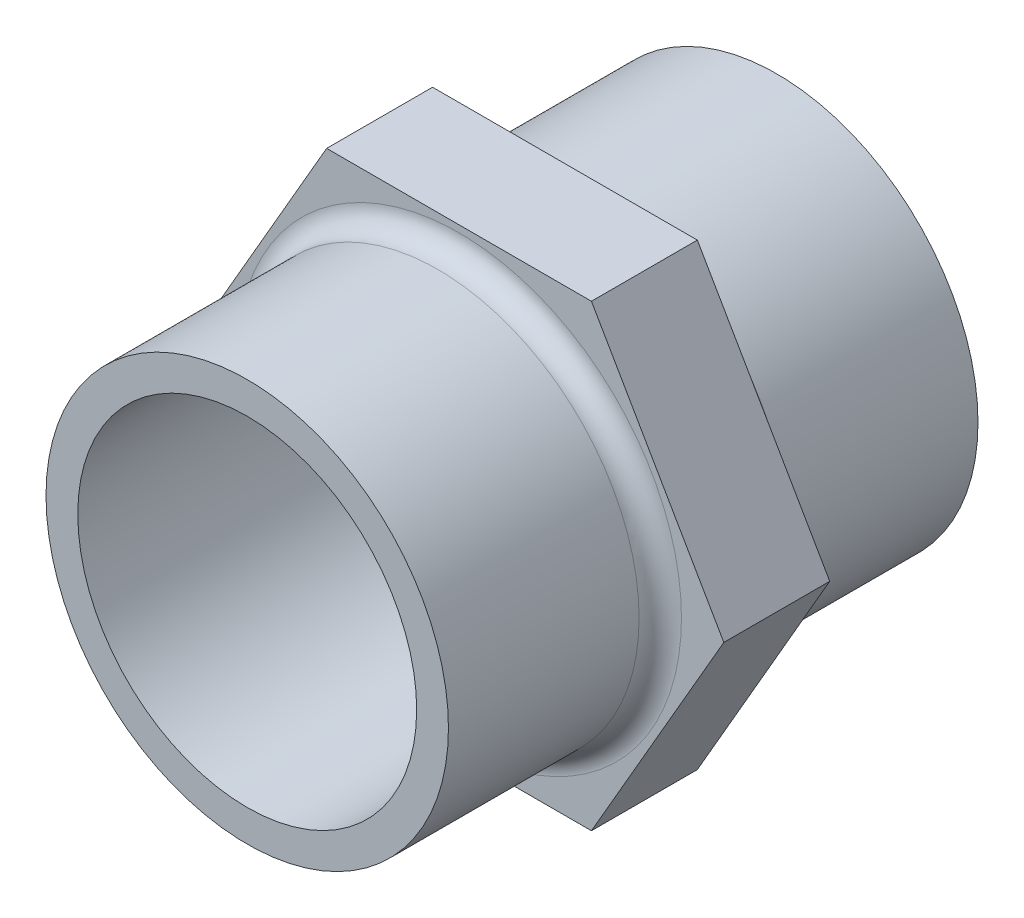
ISO-10303-21;
HEADER;
FILE_DESCRIPTION(('STEP AP214'),'2;1');
FILE_NAME('part.step','',(''),(''),'','','');
FILE_SCHEMA(('AUTOMOTIVE_DESIGN { 1 0 10303 214 1 1 1 1 }'));
ENDSEC;
DATA;
#1=APPLICATION_CONTEXT('core data for automotive mechanical design processes');
#2=APPLICATION_PROTOCOL_DEFINITION('international standard','automotive_design',2000,#1);
#3=PRODUCT_CONTEXT('',#1,'mechanical');
#4=PRODUCT('Part','Part','',(#3));
#5=PRODUCT_RELATED_PRODUCT_CATEGORY('part','',(#4));
#6=PRODUCT_DEFINITION_FORMATION('','',#4);
#7=PRODUCT_DEFINITION_CONTEXT('part definition',#1,'design');
#8=PRODUCT_DEFINITION('design','',#6,#7);
#9=PRODUCT_DEFINITION_SHAPE('','',#8);
#10=(LENGTH_UNIT() NAMED_UNIT(*) SI_UNIT(.MILLI.,.METRE.));
#11=(NAMED_UNIT(*) PLANE_ANGLE_UNIT() SI_UNIT($,.RADIAN.));
#12=(NAMED_UNIT(*) SI_UNIT($,.STERADIAN.) SOLID_ANGLE_UNIT());
#13=UNCERTAINTY_MEASURE_WITH_UNIT(LENGTH_MEASURE(1.E-05),#10,'distance_accuracy_value','');
#14=(GEOMETRIC_REPRESENTATION_CONTEXT(3) GLOBAL_UNCERTAINTY_ASSIGNED_CONTEXT((#13)) GLOBAL_UNIT_ASSIGNED_CONTEXT((#10,
#11,#12)) REPRESENTATION_CONTEXT('',''));
#15=CARTESIAN_POINT('',(0.,0.,0.));
#16=DIRECTION('',(0.,0.,1.));
#17=DIRECTION('',(1.,0.,0.));
#18=AXIS2_PLACEMENT_3D('',#15,#16,#17);
#19=CARTESIAN_POINT('',(-12.5,0.,2.5));
#20=DIRECTION('',(0.866025403784439,0.5,0.));
#21=DIRECTION('',(-0.5,0.866025403784439,0.));
#22=AXIS2_PLACEMENT_3D('',#19,#20,#21);
#23=PLANE('',#22);
#24=DIRECTION('',(0.5,-0.866025403784439,0.));
#25=VECTOR('',#24,1.);
#26=CARTESIAN_POINT('',(-12.5,0.,-2.5));
#27=LINE('',#26,#25);
#28=CARTESIAN_POINT('',(-12.5,0.,-2.5));
#29=VERTEX_POINT('',#28);
#30=CARTESIAN_POINT('',(-6.25,-10.8253175473055,-2.5));
#31=VERTEX_POINT('',#30);
#32=EDGE_CURVE('E125',#29,#31,#27,.T.);
#33=ORIENTED_EDGE('',*,*,#32,.T.);
#34=DIRECTION('',(0.,0.,-1.));
#35=VECTOR('',#34,1.);
#36=CARTESIAN_POINT('',(-6.25,-10.8253175473055,2.5));
#37=LINE('',#36,#35);
#38=CARTESIAN_POINT('',(-6.25,-10.8253175473055,2.5));
#39=VERTEX_POINT('',#38);
#40=EDGE_CURVE('E143',#39,#31,#37,.T.);
#41=ORIENTED_EDGE('',*,*,#40,.F.);
#42=DIRECTION('',(0.5,-0.866025403784439,0.));
#43=VECTOR('',#42,1.);
#44=CARTESIAN_POINT('',(-12.5,0.,2.5));
#45=LINE('',#44,#43);
#46=CARTESIAN_POINT('',(-12.5,0.,2.5));
#47=VERTEX_POINT('',#46);
#48=EDGE_CURVE('E136',#47,#39,#45,.T.);
#49=ORIENTED_EDGE('',*,*,#48,.F.);
#50=DIRECTION('',(0.,0.,-1.));
#51=VECTOR('',#50,1.);
#52=CARTESIAN_POINT('',(-12.5,0.,2.5));
#53=LINE('',#52,#51);
#54=EDGE_CURVE('E121',#47,#29,#53,.T.);
#55=ORIENTED_EDGE('',*,*,#54,.T.);
#56=EDGE_LOOP('',(#33,#41,#49,#55));
#57=FACE_BOUND('',#56,.T.);
#58=ADVANCED_FACE('F39',(#57),#23,.F.);
#59=CARTESIAN_POINT('',(-6.25,-10.8253175473055,2.5));
#60=DIRECTION('',(0.,1.,0.));
#61=DIRECTION('',(0.,0.,1.));
#62=AXIS2_PLACEMENT_3D('',#59,#60,#61);
#63=PLANE('',#62);
#64=DIRECTION('',(1.,0.,0.));
#65=VECTOR('',#64,1.);
#66=CARTESIAN_POINT('',(-6.25,-10.8253175473055,-2.5));
#67=LINE('',#66,#65);
#68=CARTESIAN_POINT('',(6.25,-10.8253175473055,-2.5));
#69=VERTEX_POINT('',#68);
#70=EDGE_CURVE('E128',#31,#69,#67,.T.);
#71=ORIENTED_EDGE('',*,*,#70,.T.);
#72=DIRECTION('',(0.,0.,-1.));
#73=VECTOR('',#72,1.);
#74=CARTESIAN_POINT('',(6.25,-10.8253175473055,2.5));
#75=LINE('',#74,#73);
#76=CARTESIAN_POINT('',(6.25,-10.8253175473055,2.5));
#77=VERTEX_POINT('',#76);
#78=EDGE_CURVE('E140',#77,#69,#75,.T.);
#79=ORIENTED_EDGE('',*,*,#78,.F.);
#80=DIRECTION('',(1.,0.,0.));
#81=VECTOR('',#80,1.);
#82=CARTESIAN_POINT('',(-6.25,-10.8253175473055,2.5));
#83=LINE('',#82,#81);
#84=EDGE_CURVE('E94',#39,#77,#83,.T.);
#85=ORIENTED_EDGE('',*,*,#84,.F.);
#86=ORIENTED_EDGE('',*,*,#40,.T.);
#87=EDGE_LOOP('',(#71,#79,#85,#86));
#88=FACE_BOUND('',#87,.T.);
#89=ADVANCED_FACE('F164',(#88),#63,.F.);
#90=CARTESIAN_POINT('',(6.25,-10.8253175473055,2.5));
#91=DIRECTION('',(-0.866025403784439,0.5,0.));
#92=DIRECTION('',(-0.5,-0.866025403784439,0.));
#93=AXIS2_PLACEMENT_3D('',#90,#91,#92);
#94=PLANE('',#93);
#95=DIRECTION('',(0.5,0.866025403784439,0.));
#96=VECTOR('',#95,1.);
#97=CARTESIAN_POINT('',(6.25,-10.8253175473055,-2.5));
#98=LINE('',#97,#96);
#99=CARTESIAN_POINT('',(12.5,0.,-2.5));
#100=VERTEX_POINT('',#99);
#101=EDGE_CURVE('E131',#69,#100,#98,.T.);
#102=ORIENTED_EDGE('',*,*,#101,.T.);
#103=DIRECTION('',(0.,0.,-1.));
#104=VECTOR('',#103,1.);
#105=CARTESIAN_POINT('',(12.5,0.,2.5));
#106=LINE('',#105,#104);
#107=CARTESIAN_POINT('',(12.5,0.,2.5));
#108=VERTEX_POINT('',#107);
#109=EDGE_CURVE('E116',#108,#100,#106,.T.);
#110=ORIENTED_EDGE('',*,*,#109,.F.);
#111=DIRECTION('',(0.5,0.866025403784439,0.));
#112=VECTOR('',#111,1.);
#113=CARTESIAN_POINT('',(6.25,-10.8253175473055,2.5));
#114=LINE('',#113,#112);
#115=EDGE_CURVE('E107',#77,#108,#114,.T.);
#116=ORIENTED_EDGE('',*,*,#115,.F.);
#117=ORIENTED_EDGE('',*,*,#78,.T.);
#118=EDGE_LOOP('',(#102,#110,#116,#117));
#119=FACE_BOUND('',#118,.T.);
#120=ADVANCED_FACE('F170',(#119),#94,.F.);
#121=CARTESIAN_POINT('',(6.25,10.8253175473055,2.5));
#122=DIRECTION('',(-0.866025403784439,-0.5,0.));
#123=DIRECTION('',(0.5,-0.866025403784439,0.));
#124=AXIS2_PLACEMENT_3D('',#121,#122,#123);
#125=PLANE('',#124);
#126=DIRECTION('',(-0.5,0.866025403784439,0.));
#127=VECTOR('',#126,1.);
#128=CARTESIAN_POINT('',(6.25,10.8253175473055,-2.5));
#129=LINE('',#128,#127);
#130=CARTESIAN_POINT('',(6.25,10.8253175473055,-2.5));
#131=VERTEX_POINT('',#130);
#132=EDGE_CURVE('E115',#100,#131,#129,.T.);
#133=ORIENTED_EDGE('',*,*,#132,.T.);
#134=DIRECTION('',(0.,0.,-1.));
#135=VECTOR('',#134,1.);
#136=CARTESIAN_POINT('',(6.25,10.8253175473055,2.5));
#137=LINE('',#136,#135);
#138=CARTESIAN_POINT('',(6.25,10.8253175473055,2.5));
#139=VERTEX_POINT('',#138);
#140=EDGE_CURVE('E112',#139,#131,#137,.T.);
#141=ORIENTED_EDGE('',*,*,#140,.F.);
#142=DIRECTION('',(-0.5,0.866025403784439,0.));
#143=VECTOR('',#142,1.);
#144=CARTESIAN_POINT('',(6.25,10.8253175473055,2.5));
#145=LINE('',#144,#143);
#146=EDGE_CURVE('E101',#108,#139,#145,.T.);
#147=ORIENTED_EDGE('',*,*,#146,.F.);
#148=ORIENTED_EDGE('',*,*,#109,.T.);
#149=EDGE_LOOP('',(#133,#141,#147,#148));
#150=FACE_BOUND('',#149,.T.);
#151=ADVANCED_FACE('F113',(#150),#125,.F.);
#152=CARTESIAN_POINT('',(-6.25,10.8253175473055,2.5));
#153=DIRECTION('',(0.,-1.,0.));
#154=DIRECTION('',(0.,0.,-1.));
#155=AXIS2_PLACEMENT_3D('',#152,#153,#154);
#156=PLANE('',#155);
#157=DIRECTION('',(-1.,0.,0.));
#158=VECTOR('',#157,1.);
#159=CARTESIAN_POINT('',(-6.25,10.8253175473055,-2.5));
#160=LINE('',#159,#158);
#161=CARTESIAN_POINT('',(-6.25,10.8253175473055,-2.5));
#162=VERTEX_POINT('',#161);
#163=EDGE_CURVE('E79',#131,#162,#160,.T.);
#164=ORIENTED_EDGE('',*,*,#163,.T.);
#165=DIRECTION('',(0.,0.,-1.));
#166=VECTOR('',#165,1.);
#167=CARTESIAN_POINT('',(-6.25,10.8253175473055,2.5));
#168=LINE('',#167,#166);
#169=CARTESIAN_POINT('',(-6.25,10.8253175473055,2.5));
#170=VERTEX_POINT('',#169);
#171=EDGE_CURVE('E117',#170,#162,#168,.T.);
#172=ORIENTED_EDGE('',*,*,#171,.F.);
#173=DIRECTION('',(-1.,0.,0.));
#174=VECTOR('',#173,1.);
#175=CARTESIAN_POINT('',(-6.25,10.8253175473055,2.5));
#176=LINE('',#175,#174);
#177=EDGE_CURVE('E105',#139,#170,#176,.T.);
#178=ORIENTED_EDGE('',*,*,#177,.F.);
#179=ORIENTED_EDGE('',*,*,#140,.T.);
#180=EDGE_LOOP('',(#164,#172,#178,#179));
#181=FACE_BOUND('',#180,.T.);
#182=ADVANCED_FACE('F119',(#181),#156,.F.);
#183=CARTESIAN_POINT('',(-12.5,0.,2.5));
#184=DIRECTION('',(0.866025403784439,-0.5,0.));
#185=DIRECTION('',(0.5,0.866025403784439,0.));
#186=AXIS2_PLACEMENT_3D('',#183,#184,#185);
#187=PLANE('',#186);
#188=DIRECTION('',(-0.5,-0.866025403784439,0.));
#189=VECTOR('',#188,1.);
#190=CARTESIAN_POINT('',(-12.5,0.,-2.5));
#191=LINE('',#190,#189);
#192=EDGE_CURVE('E85',#162,#29,#191,.T.);
#193=ORIENTED_EDGE('',*,*,#192,.T.);
#194=ORIENTED_EDGE('',*,*,#54,.F.);
#195=DIRECTION('',(-0.5,-0.866025403784439,0.));
#196=VECTOR('',#195,1.);
#197=CARTESIAN_POINT('',(-12.5,0.,2.5));
#198=LINE('',#197,#196);
#199=EDGE_CURVE('E56',#170,#47,#198,.T.);
#200=ORIENTED_EDGE('',*,*,#199,.F.);
#201=ORIENTED_EDGE('',*,*,#171,.T.);
#202=EDGE_LOOP('',(#193,#194,#200,#201));
#203=FACE_BOUND('',#202,.T.);
#204=ADVANCED_FACE('F180',(#203),#187,.F.);
#205=CARTESIAN_POINT('',(0.,0.,2.5));
#206=DIRECTION('',(0.,0.,1.));
#207=DIRECTION('',(1.,0.,0.));
#208=AXIS2_PLACEMENT_3D('',#205,#206,#207);
#209=PLANE('',#208);
#210=CARTESIAN_POINT('',(0.,0.,2.5));
#211=DIRECTION('',(0.,0.,1.));
#212=DIRECTION('',(1.,0.,0.));
#213=AXIS2_PLACEMENT_3D('',#210,#211,#212);
#214=CIRCLE('',#213,10.5);
#215=CARTESIAN_POINT('',(10.5,0.,2.5));
#216=VERTEX_POINT('',#215);
#217=EDGE_CURVE('E48',#216,#216,#214,.F.);
#218=ORIENTED_EDGE('',*,*,#217,.T.);
#219=EDGE_LOOP('',(#218));
#220=FACE_BOUND('',#219,.T.);
#221=ORIENTED_EDGE('',*,*,#48,.T.);
#222=ORIENTED_EDGE('',*,*,#84,.T.);
#223=ORIENTED_EDGE('',*,*,#115,.T.);
#224=ORIENTED_EDGE('',*,*,#146,.T.);
#225=ORIENTED_EDGE('',*,*,#177,.T.);
#226=ORIENTED_EDGE('',*,*,#199,.T.);
#227=EDGE_LOOP('',(#221,#222,#223,#224,#225,#226));
#228=FACE_BOUND('',#227,.T.);
#229=ADVANCED_FACE('F103',(#220,#228),#209,.T.);
#230=CARTESIAN_POINT('',(0.,0.,-2.5));
#231=DIRECTION('',(0.,0.,1.));
#232=DIRECTION('',(1.,0.,0.));
#233=AXIS2_PLACEMENT_3D('',#230,#231,#232);
#234=PLANE('',#233);
#235=CARTESIAN_POINT('',(0.,0.,-2.5));
#236=DIRECTION('',(0.,0.,1.));
#237=DIRECTION('',(1.,0.,0.));
#238=AXIS2_PLACEMENT_3D('',#235,#236,#237);
#239=CIRCLE('',#238,10.5);
#240=CARTESIAN_POINT('',(10.5,0.,-2.5));
#241=VERTEX_POINT('',#240);
#242=EDGE_CURVE('E148',#241,#241,#239,.T.);
#243=ORIENTED_EDGE('',*,*,#242,.T.);
#244=EDGE_LOOP('',(#243));
#245=FACE_BOUND('',#244,.T.);
#246=ORIENTED_EDGE('',*,*,#32,.F.);
#247=ORIENTED_EDGE('',*,*,#192,.F.);
#248=ORIENTED_EDGE('',*,*,#163,.F.);
#249=ORIENTED_EDGE('',*,*,#132,.F.);
#250=ORIENTED_EDGE('',*,*,#101,.F.);
#251=ORIENTED_EDGE('',*,*,#70,.F.);
#252=EDGE_LOOP('',(#246,#247,#248,#249,#250,#251));
#253=FACE_BOUND('',#252,.T.);
#254=ADVANCED_FACE('F183',(#245,#253),#234,.F.);
#255=CARTESIAN_POINT('',(0.,0.,-12.5));
#256=DIRECTION('',(0.,0.,1.));
#257=DIRECTION('',(1.,0.,0.));
#258=AXIS2_PLACEMENT_3D('',#255,#256,#257);
#259=PLANE('',#258);
#260=CARTESIAN_POINT('',(0.,0.,-12.5));
#261=DIRECTION('',(0.,0.,1.));
#262=DIRECTION('',(1.,0.,0.));
#263=AXIS2_PLACEMENT_3D('',#260,#261,#262);
#264=CIRCLE('',#263,8.);
#265=CARTESIAN_POINT('',(8.,0.,-12.5));
#266=VERTEX_POINT('',#265);
#267=EDGE_CURVE('E209',#266,#266,#264,.T.);
#268=ORIENTED_EDGE('',*,*,#267,.T.);
#269=EDGE_LOOP('',(#268));
#270=FACE_BOUND('',#269,.T.);
#271=CARTESIAN_POINT('',(0.,0.,-12.5));
#272=DIRECTION('',(0.,0.,1.));
#273=DIRECTION('',(1.,0.,0.));
#274=AXIS2_PLACEMENT_3D('',#271,#272,#273);
#275=CIRCLE('',#274,9.5);
#276=CARTESIAN_POINT('',(9.5,0.,-12.5));
#277=VERTEX_POINT('',#276);
#278=EDGE_CURVE('E214',#277,#277,#275,.T.);
#279=ORIENTED_EDGE('',*,*,#278,.F.);
#280=EDGE_LOOP('',(#279));
#281=FACE_BOUND('',#280,.T.);
#282=ADVANCED_FACE('F186',(#270,#281),#259,.F.);
#283=CARTESIAN_POINT('',(0.,0.,12.5));
#284=DIRECTION('',(0.,0.,-1.));
#285=DIRECTION('',(-1.,0.,0.));
#286=AXIS2_PLACEMENT_3D('',#283,#284,#285);
#287=CYLINDRICAL_SURFACE('',#286,9.5);
#288=CARTESIAN_POINT('',(0.,0.,-3.5));
#289=DIRECTION('',(0.,0.,1.));
#290=DIRECTION('',(1.,0.,0.));
#291=AXIS2_PLACEMENT_3D('',#288,#289,#290);
#292=CIRCLE('',#291,9.5);
#293=CARTESIAN_POINT('',(9.5,0.,-3.5));
#294=VERTEX_POINT('',#293);
#295=EDGE_CURVE('E145',#294,#294,#292,.F.);
#296=ORIENTED_EDGE('',*,*,#295,.T.);
#297=EDGE_LOOP('',(#296));
#298=FACE_BOUND('',#297,.T.);
#299=ORIENTED_EDGE('',*,*,#278,.T.);
#300=EDGE_LOOP('',(#299));
#301=FACE_BOUND('',#300,.T.);
#302=ADVANCED_FACE('F194',(#298,#301),#287,.T.);
#303=CARTESIAN_POINT('',(0.,0.,3.5));
#304=DIRECTION('',(0.,0.,1.));
#305=DIRECTION('',(1.,0.,0.));
#306=AXIS2_PLACEMENT_3D('',#303,#304,#305);
#307=CIRCLE('',#306,9.5);
#308=CARTESIAN_POINT('',(9.5,0.,3.5));
#309=VERTEX_POINT('',#308);
#310=EDGE_CURVE('E11',#309,#309,#307,.T.);
#311=ORIENTED_EDGE('',*,*,#310,.T.);
#312=EDGE_LOOP('',(#311));
#313=FACE_BOUND('',#312,.T.);
#314=CARTESIAN_POINT('',(0.,0.,12.5));
#315=DIRECTION('',(0.,0.,1.));
#316=DIRECTION('',(1.,0.,0.));
#317=AXIS2_PLACEMENT_3D('',#314,#315,#316);
#318=CIRCLE('',#317,9.5);
#319=CARTESIAN_POINT('',(9.5,0.,12.5));
#320=VERTEX_POINT('',#319);
#321=EDGE_CURVE('E129',#320,#320,#318,.T.);
#322=ORIENTED_EDGE('',*,*,#321,.F.);
#323=EDGE_LOOP('',(#322));
#324=FACE_BOUND('',#323,.T.);
#325=ADVANCED_FACE('F190',(#313,#324),#287,.T.);
#326=CARTESIAN_POINT('',(0.,0.,12.5));
#327=DIRECTION('',(0.,0.,1.));
#328=DIRECTION('',(1.,0.,0.));
#329=AXIS2_PLACEMENT_3D('',#326,#327,#328);
#330=PLANE('',#329);
#331=CARTESIAN_POINT('',(0.,0.,12.5));
#332=DIRECTION('',(0.,0.,1.));
#333=DIRECTION('',(1.,0.,0.));
#334=AXIS2_PLACEMENT_3D('',#331,#332,#333);
#335=CIRCLE('',#334,8.);
#336=CARTESIAN_POINT('',(8.,0.,12.5));
#337=VERTEX_POINT('',#336);
#338=EDGE_CURVE('E212',#337,#337,#335,.T.);
#339=ORIENTED_EDGE('',*,*,#338,.F.);
#340=EDGE_LOOP('',(#339));
#341=FACE_BOUND('',#340,.T.);
#342=ORIENTED_EDGE('',*,*,#321,.T.);
#343=EDGE_LOOP('',(#342));
#344=FACE_BOUND('',#343,.T.);
#345=ADVANCED_FACE('F193',(#341,#344),#330,.T.);
#346=CARTESIAN_POINT('',(0.,0.,-12.5));
#347=DIRECTION('',(0.,0.,1.));
#348=DIRECTION('',(1.,0.,0.));
#349=AXIS2_PLACEMENT_3D('',#346,#347,#348);
#350=CYLINDRICAL_SURFACE('',#349,8.);
#351=ORIENTED_EDGE('',*,*,#267,.F.);
#352=EDGE_LOOP('',(#351));
#353=FACE_BOUND('',#352,.T.);
#354=ORIENTED_EDGE('',*,*,#338,.T.);
#355=EDGE_LOOP('',(#354));
#356=FACE_BOUND('',#355,.T.);
#357=ADVANCED_FACE('F160',(#353,#356),#350,.F.);
#358=CARTESIAN_POINT('',(0.,0.,-3.5));
#359=DIRECTION('',(0.,0.,1.));
#360=DIRECTION('',(1.,0.,0.));
#361=AXIS2_PLACEMENT_3D('',#358,#359,#360);
#362=TOROIDAL_SURFACE('',#361,10.5,1.);
#363=ORIENTED_EDGE('',*,*,#242,.F.);
#364=EDGE_LOOP('',(#363));
#365=FACE_BOUND('',#364,.T.);
#366=ORIENTED_EDGE('',*,*,#295,.F.);
#367=EDGE_LOOP('',(#366));
#368=FACE_BOUND('',#367,.T.);
#369=ADVANCED_FACE('F155',(#365,#368),#362,.F.);
#370=CARTESIAN_POINT('',(0.,0.,3.5));
#371=DIRECTION('',(0.,0.,1.));
#372=DIRECTION('',(1.,0.,0.));
#373=AXIS2_PLACEMENT_3D('',#370,#371,#372);
#374=TOROIDAL_SURFACE('',#373,10.5,1.);
#375=ORIENTED_EDGE('',*,*,#310,.F.);
#376=EDGE_LOOP('',(#375));
#377=FACE_BOUND('',#376,.T.);
#378=ORIENTED_EDGE('',*,*,#217,.F.);
#379=EDGE_LOOP('',(#378));
#380=FACE_BOUND('',#379,.T.);
#381=ADVANCED_FACE('F41',(#377,#380),#374,.F.);
#382=CLOSED_SHELL('',(#58,#89,#120,#151,#182,#204,#229,#254,#282,#302,#325,#345,#357,#369,#381));
#383=MANIFOLD_SOLID_BREP('B2',#382);
#384=ADVANCED_BREP_SHAPE_REPRESENTATION('',(#18,#383),#14);
#385=SHAPE_DEFINITION_REPRESENTATION(#9,#384);
ENDSEC;
END-ISO-10303-21;
